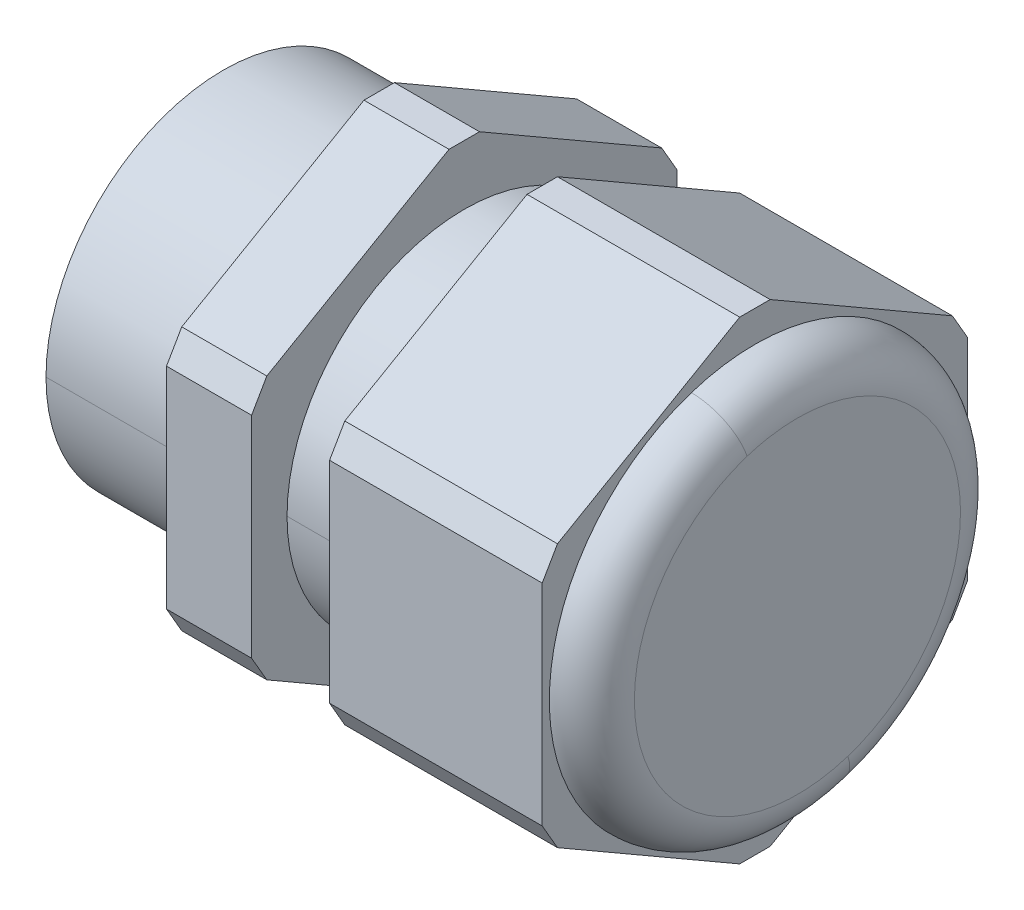
ISO-10303-21;
HEADER;
FILE_DESCRIPTION(('STEP AP214'),'2;1');
FILE_NAME('part.step','',(''),(''),'','','');
FILE_SCHEMA(('AUTOMOTIVE_DESIGN { 1 0 10303 214 1 1 1 1 }'));
ENDSEC;
DATA;
#1=APPLICATION_CONTEXT('core data for automotive mechanical design processes');
#2=APPLICATION_PROTOCOL_DEFINITION('international standard','automotive_design',2000,#1);
#3=PRODUCT_CONTEXT('',#1,'mechanical');
#4=PRODUCT('Part','Part','',(#3));
#5=PRODUCT_RELATED_PRODUCT_CATEGORY('part','',(#4));
#6=PRODUCT_DEFINITION_FORMATION('','',#4);
#7=PRODUCT_DEFINITION_CONTEXT('part definition',#1,'design');
#8=PRODUCT_DEFINITION('design','',#6,#7);
#9=PRODUCT_DEFINITION_SHAPE('','',#8);
#10=(LENGTH_UNIT() NAMED_UNIT(*) SI_UNIT(.MILLI.,.METRE.));
#11=(NAMED_UNIT(*) PLANE_ANGLE_UNIT() SI_UNIT($,.RADIAN.));
#12=(NAMED_UNIT(*) SI_UNIT($,.STERADIAN.) SOLID_ANGLE_UNIT());
#13=UNCERTAINTY_MEASURE_WITH_UNIT(LENGTH_MEASURE(1.E-05),#10,'distance_accuracy_value','');
#14=(GEOMETRIC_REPRESENTATION_CONTEXT(3) GLOBAL_UNCERTAINTY_ASSIGNED_CONTEXT((#13)) GLOBAL_UNIT_ASSIGNED_CONTEXT((#10,
#11,#12)) REPRESENTATION_CONTEXT('',''));
#15=CARTESIAN_POINT('',(0.,0.,0.));
#16=DIRECTION('',(0.,0.,1.));
#17=DIRECTION('',(1.,0.,0.));
#18=AXIS2_PLACEMENT_3D('',#15,#16,#17);
#19=CARTESIAN_POINT('',(40.5,0.,0.));
#20=DIRECTION('',(1.,0.,0.));
#21=DIRECTION('',(0.,1.,0.));
#22=AXIS2_PLACEMENT_3D('',#19,#20,#21);
#23=CYLINDRICAL_SURFACE('',#22,12.5);
#24=DIRECTION('',(1.,0.,0.));
#25=VECTOR('',#24,1.);
#26=CARTESIAN_POINT('',(17.,0.,12.5));
#27=LINE('',#26,#25);
#28=CARTESIAN_POINT('',(17.,0.,12.5));
#29=VERTEX_POINT('',#28);
#30=CARTESIAN_POINT('',(22.5,0.,12.5));
#31=VERTEX_POINT('',#30);
#32=EDGE_CURVE('E11',#29,#31,#27,.T.);
#33=ORIENTED_EDGE('',*,*,#32,.F.);
#34=CARTESIAN_POINT('',(17.,0.,0.));
#35=DIRECTION('',(1.,0.,0.));
#36=DIRECTION('',(0.,0.,-1.));
#37=AXIS2_PLACEMENT_3D('',#34,#35,#36);
#38=CIRCLE('',#37,12.5);
#39=CARTESIAN_POINT('',(17.,0.,-12.5));
#40=VERTEX_POINT('',#39);
#41=EDGE_CURVE('E25',#29,#40,#38,.T.);
#42=ORIENTED_EDGE('',*,*,#41,.T.);
#43=DIRECTION('',(1.,0.,0.));
#44=VECTOR('',#43,1.);
#45=CARTESIAN_POINT('',(17.,0.,-12.5));
#46=LINE('',#45,#44);
#47=CARTESIAN_POINT('',(22.5,0.,-12.5));
#48=VERTEX_POINT('',#47);
#49=EDGE_CURVE('E651',#40,#48,#46,.T.);
#50=ORIENTED_EDGE('',*,*,#49,.T.);
#51=CARTESIAN_POINT('',(22.5,0.,0.));
#52=DIRECTION('',(1.,0.,0.));
#53=DIRECTION('',(0.,0.,-1.));
#54=AXIS2_PLACEMENT_3D('',#51,#52,#53);
#55=CIRCLE('',#54,12.5);
#56=EDGE_CURVE('E646',#31,#48,#55,.T.);
#57=ORIENTED_EDGE('',*,*,#56,.F.);
#58=EDGE_LOOP('',(#33,#42,#50,#57));
#59=FACE_BOUND('',#58,.T.);
#60=ADVANCED_FACE('F17',(#59),#23,.T.);
#61=CARTESIAN_POINT('',(22.5,0.,0.));
#62=DIRECTION('',(1.,0.,0.));
#63=DIRECTION('',(0.,0.,-1.));
#64=AXIS2_PLACEMENT_3D('',#61,#62,#63);
#65=PLANE('',#64);
#66=CARTESIAN_POINT('',(22.5,0.,0.));
#67=DIRECTION('',(1.,0.,0.));
#68=DIRECTION('',(0.,0.,-1.));
#69=AXIS2_PLACEMENT_3D('',#66,#67,#68);
#70=CIRCLE('',#69,12.5);
#71=EDGE_CURVE('E641',#48,#31,#70,.T.);
#72=ORIENTED_EDGE('',*,*,#71,.T.);
#73=ORIENTED_EDGE('',*,*,#56,.T.);
#74=EDGE_LOOP('',(#72,#73));
#75=FACE_BOUND('',#74,.T.);
#76=DIRECTION('',(0.,-1.,0.));
#77=VECTOR('',#76,1.);
#78=CARTESIAN_POINT('',(22.5,8.6602540378444,15.));
#79=LINE('',#78,#77);
#80=CARTESIAN_POINT('',(22.5,7.41923788646729,15.));
#81=VERTEX_POINT('',#80);
#82=CARTESIAN_POINT('',(22.5,-7.41923788646736,15.));
#83=VERTEX_POINT('',#82);
#84=EDGE_CURVE('E636',#81,#83,#79,.T.);
#85=ORIENTED_EDGE('',*,*,#84,.F.);
#86=DIRECTION('',(0.,0.866025403784426,-0.500000000000021));
#87=VECTOR('',#86,1.);
#88=CARTESIAN_POINT('',(22.5,8.35000000000045,14.4626242432001));
#89=LINE('',#88,#87);
#90=CARTESIAN_POINT('',(22.5,9.28076211353304,13.9252484864005));
#91=VERTEX_POINT('',#90);
#92=EDGE_CURVE('E632',#81,#91,#89,.T.);
#93=ORIENTED_EDGE('',*,*,#92,.T.);
#94=DIRECTION('',(0.,-0.500000000000009,0.866025403784433));
#95=VECTOR('',#94,1.);
#96=CARTESIAN_POINT('',(22.5,17.320508075689,0.));
#97=LINE('',#96,#95);
#98=CARTESIAN_POINT('',(22.5,16.7,1.07475151360011));
#99=VERTEX_POINT('',#98);
#100=EDGE_CURVE('E627',#99,#91,#97,.T.);
#101=ORIENTED_EDGE('',*,*,#100,.F.);
#102=DIRECTION('',(0.,0.,-1.));
#103=VECTOR('',#102,1.);
#104=CARTESIAN_POINT('',(22.5,16.7,0.));
#105=LINE('',#104,#103);
#106=CARTESIAN_POINT('',(22.5,16.7,-1.07475151360011));
#107=VERTEX_POINT('',#106);
#108=EDGE_CURVE('E623',#99,#107,#105,.T.);
#109=ORIENTED_EDGE('',*,*,#108,.T.);
#110=DIRECTION('',(0.,0.500000000000009,0.866025403784433));
#111=VECTOR('',#110,1.);
#112=CARTESIAN_POINT('',(22.5,8.6602540378444,-15.));
#113=LINE('',#112,#111);
#114=CARTESIAN_POINT('',(22.5,9.28076211353298,-13.9252484864006));
#115=VERTEX_POINT('',#114);
#116=EDGE_CURVE('E618',#115,#107,#113,.T.);
#117=ORIENTED_EDGE('',*,*,#116,.F.);
#118=DIRECTION('',(0.,-0.866025403784428,-0.500000000000018));
#119=VECTOR('',#118,1.);
#120=CARTESIAN_POINT('',(22.5,8.35000000000041,-14.4626242432002));
#121=LINE('',#120,#119);
#122=CARTESIAN_POINT('',(22.5,7.41923788646736,-15.));
#123=VERTEX_POINT('',#122);
#124=EDGE_CURVE('E614',#115,#123,#121,.T.);
#125=ORIENTED_EDGE('',*,*,#124,.T.);
#126=DIRECTION('',(0.,1.,0.));
#127=VECTOR('',#126,1.);
#128=CARTESIAN_POINT('',(22.5,-8.6602540378444,-15.));
#129=LINE('',#128,#127);
#130=CARTESIAN_POINT('',(22.5,-7.41923788646729,-15.));
#131=VERTEX_POINT('',#130);
#132=EDGE_CURVE('E609',#131,#123,#129,.T.);
#133=ORIENTED_EDGE('',*,*,#132,.F.);
#134=DIRECTION('',(0.,-0.866025403784426,0.500000000000021));
#135=VECTOR('',#134,1.);
#136=CARTESIAN_POINT('',(22.5,-8.35000000000045,-14.4626242432001));
#137=LINE('',#136,#135);
#138=CARTESIAN_POINT('',(22.5,-9.28076211353304,-13.9252484864005));
#139=VERTEX_POINT('',#138);
#140=EDGE_CURVE('E605',#131,#139,#137,.T.);
#141=ORIENTED_EDGE('',*,*,#140,.T.);
#142=DIRECTION('',(0.,0.500000000000009,-0.866025403784433));
#143=VECTOR('',#142,1.);
#144=CARTESIAN_POINT('',(22.5,-17.320508075689,0.));
#145=LINE('',#144,#143);
#146=CARTESIAN_POINT('',(22.5,-16.7,-1.07475151360011));
#147=VERTEX_POINT('',#146);
#148=EDGE_CURVE('E600',#147,#139,#145,.T.);
#149=ORIENTED_EDGE('',*,*,#148,.F.);
#150=DIRECTION('',(0.,0.,1.));
#151=VECTOR('',#150,1.);
#152=CARTESIAN_POINT('',(22.5,-16.7,0.));
#153=LINE('',#152,#151);
#154=CARTESIAN_POINT('',(22.5,-16.7,1.07475151360011));
#155=VERTEX_POINT('',#154);
#156=EDGE_CURVE('E596',#147,#155,#153,.T.);
#157=ORIENTED_EDGE('',*,*,#156,.T.);
#158=DIRECTION('',(0.,-0.500000000000009,-0.866025403784433));
#159=VECTOR('',#158,1.);
#160=CARTESIAN_POINT('',(22.5,-8.6602540378444,15.));
#161=LINE('',#160,#159);
#162=CARTESIAN_POINT('',(22.5,-9.28076211353298,13.9252484864006));
#163=VERTEX_POINT('',#162);
#164=EDGE_CURVE('E591',#163,#155,#161,.T.);
#165=ORIENTED_EDGE('',*,*,#164,.F.);
#166=DIRECTION('',(0.,0.866025403784428,0.500000000000018));
#167=VECTOR('',#166,1.);
#168=CARTESIAN_POINT('',(22.5,-8.35000000000041,14.4626242432002));
#169=LINE('',#168,#167);
#170=EDGE_CURVE('E587',#163,#83,#169,.T.);
#171=ORIENTED_EDGE('',*,*,#170,.T.);
#172=EDGE_LOOP('',(#85,#93,#101,#109,#117,#125,#133,#141,#149,#157,#165,#171));
#173=FACE_BOUND('',#172,.T.);
#174=ADVANCED_FACE('F664',(#75,#173),#65,.F.);
#175=CARTESIAN_POINT('',(41.,0.,19.283498990934));
#176=DIRECTION('',(0.,0.500000000000018,-0.866025403784428));
#177=DIRECTION('',(0.,0.866025403784428,0.500000000000018));
#178=AXIS2_PLACEMENT_3D('',#175,#176,#177);
#179=PLANE('',#178);
#180=DIRECTION('',(1.,0.,0.));
#181=VECTOR('',#180,1.);
#182=CARTESIAN_POINT('',(22.5,-9.28076211353298,13.9252484864006));
#183=LINE('',#182,#181);
#184=CARTESIAN_POINT('',(37.5,-9.28076211353298,13.9252484864006));
#185=VERTEX_POINT('',#184);
#186=EDGE_CURVE('E583',#163,#185,#183,.T.);
#187=ORIENTED_EDGE('',*,*,#186,.T.);
#188=DIRECTION('',(0.,0.866025403784428,0.500000000000018));
#189=VECTOR('',#188,1.);
#190=CARTESIAN_POINT('',(37.5,-8.35000000000041,14.4626242432002));
#191=LINE('',#190,#189);
#192=CARTESIAN_POINT('',(37.5,-7.41923788646737,15.));
#193=VERTEX_POINT('',#192);
#194=EDGE_CURVE('E579',#185,#193,#191,.T.);
#195=ORIENTED_EDGE('',*,*,#194,.T.);
#196=DIRECTION('',(-1.,0.,0.));
#197=VECTOR('',#196,1.);
#198=CARTESIAN_POINT('',(22.5,-7.41923788646736,15.));
#199=LINE('',#198,#197);
#200=EDGE_CURVE('E574',#193,#83,#199,.T.);
#201=ORIENTED_EDGE('',*,*,#200,.T.);
#202=ORIENTED_EDGE('',*,*,#170,.F.);
#203=EDGE_LOOP('',(#187,#195,#201,#202));
#204=FACE_BOUND('',#203,.T.);
#205=ADVANCED_FACE('F667',(#204),#179,.F.);
#206=CARTESIAN_POINT('',(22.5,8.6602540378444,15.));
#207=DIRECTION('',(0.,0.,1.));
#208=DIRECTION('',(1.,0.,0.));
#209=AXIS2_PLACEMENT_3D('',#206,#207,#208);
#210=PLANE('',#209);
#211=DIRECTION('',(1.,0.,0.));
#212=VECTOR('',#211,1.);
#213=CARTESIAN_POINT('',(22.5,7.41923788646729,15.));
#214=LINE('',#213,#212);
#215=CARTESIAN_POINT('',(37.5,7.41923788646728,15.));
#216=VERTEX_POINT('',#215);
#217=EDGE_CURVE('E569',#81,#216,#214,.T.);
#218=ORIENTED_EDGE('',*,*,#217,.F.);
#219=ORIENTED_EDGE('',*,*,#84,.T.);
#220=ORIENTED_EDGE('',*,*,#200,.F.);
#221=DIRECTION('',(0.,-1.,0.));
#222=VECTOR('',#221,1.);
#223=CARTESIAN_POINT('',(37.5,8.6602540378444,15.));
#224=LINE('',#223,#222);
#225=EDGE_CURVE('E564',#216,#193,#224,.T.);
#226=ORIENTED_EDGE('',*,*,#225,.F.);
#227=EDGE_LOOP('',(#218,#219,#220,#226));
#228=FACE_BOUND('',#227,.T.);
#229=ADVANCED_FACE('F673',(#228),#210,.T.);
#230=CARTESIAN_POINT('',(37.5,0.,0.));
#231=DIRECTION('',(1.,0.,0.));
#232=DIRECTION('',(0.,0.,-1.));
#233=AXIS2_PLACEMENT_3D('',#230,#231,#232);
#234=PLANE('',#233);
#235=DIRECTION('',(0.,0.866025403784426,-0.500000000000021));
#236=VECTOR('',#235,1.);
#237=CARTESIAN_POINT('',(37.5,8.35000000000045,14.4626242432001));
#238=LINE('',#237,#236);
#239=CARTESIAN_POINT('',(37.5,9.28076211353304,13.9252484864005));
#240=VERTEX_POINT('',#239);
#241=EDGE_CURVE('E559',#216,#240,#238,.T.);
#242=ORIENTED_EDGE('',*,*,#241,.F.);
#243=ORIENTED_EDGE('',*,*,#225,.T.);
#244=ORIENTED_EDGE('',*,*,#194,.F.);
#245=DIRECTION('',(0.,-0.500000000000009,-0.866025403784433));
#246=VECTOR('',#245,1.);
#247=CARTESIAN_POINT('',(37.5,-8.6602540378444,15.));
#248=LINE('',#247,#246);
#249=CARTESIAN_POINT('',(37.5,-16.7,1.07475151360012));
#250=VERTEX_POINT('',#249);
#251=EDGE_CURVE('E555',#185,#250,#248,.T.);
#252=ORIENTED_EDGE('',*,*,#251,.T.);
#253=DIRECTION('',(0.,0.,1.));
#254=VECTOR('',#253,1.);
#255=CARTESIAN_POINT('',(37.5,-16.7,0.));
#256=LINE('',#255,#254);
#257=CARTESIAN_POINT('',(37.5,-16.7,-1.07475151360011));
#258=VERTEX_POINT('',#257);
#259=EDGE_CURVE('E550',#258,#250,#256,.T.);
#260=ORIENTED_EDGE('',*,*,#259,.F.);
#261=DIRECTION('',(0.,0.500000000000009,-0.866025403784433));
#262=VECTOR('',#261,1.);
#263=CARTESIAN_POINT('',(37.5,-17.320508075689,0.));
#264=LINE('',#263,#262);
#265=CARTESIAN_POINT('',(37.5,-9.28076211353304,-13.9252484864005));
#266=VERTEX_POINT('',#265);
#267=EDGE_CURVE('E546',#258,#266,#264,.T.);
#268=ORIENTED_EDGE('',*,*,#267,.T.);
#269=DIRECTION('',(0.,-0.866025403784426,0.500000000000021));
#270=VECTOR('',#269,1.);
#271=CARTESIAN_POINT('',(37.5,-8.35000000000045,-14.4626242432001));
#272=LINE('',#271,#270);
#273=CARTESIAN_POINT('',(37.5,-7.41923788646728,-15.));
#274=VERTEX_POINT('',#273);
#275=EDGE_CURVE('E541',#274,#266,#272,.T.);
#276=ORIENTED_EDGE('',*,*,#275,.F.);
#277=DIRECTION('',(0.,1.,0.));
#278=VECTOR('',#277,1.);
#279=CARTESIAN_POINT('',(37.5,-8.6602540378444,-15.));
#280=LINE('',#279,#278);
#281=CARTESIAN_POINT('',(37.5,7.41923788646737,-15.));
#282=VERTEX_POINT('',#281);
#283=EDGE_CURVE('E537',#274,#282,#280,.T.);
#284=ORIENTED_EDGE('',*,*,#283,.T.);
#285=DIRECTION('',(0.,-0.866025403784428,-0.500000000000018));
#286=VECTOR('',#285,1.);
#287=CARTESIAN_POINT('',(37.5,8.35000000000041,-14.4626242432002));
#288=LINE('',#287,#286);
#289=CARTESIAN_POINT('',(37.5,9.28076211353298,-13.9252484864006));
#290=VERTEX_POINT('',#289);
#291=EDGE_CURVE('E532',#290,#282,#288,.T.);
#292=ORIENTED_EDGE('',*,*,#291,.F.);
#293=DIRECTION('',(0.,0.500000000000009,0.866025403784433));
#294=VECTOR('',#293,1.);
#295=CARTESIAN_POINT('',(37.5,8.6602540378444,-15.));
#296=LINE('',#295,#294);
#297=CARTESIAN_POINT('',(37.5,16.7,-1.07475151360012));
#298=VERTEX_POINT('',#297);
#299=EDGE_CURVE('E528',#290,#298,#296,.T.);
#300=ORIENTED_EDGE('',*,*,#299,.T.);
#301=DIRECTION('',(0.,0.,-1.));
#302=VECTOR('',#301,1.);
#303=CARTESIAN_POINT('',(37.5,16.7,0.));
#304=LINE('',#303,#302);
#305=CARTESIAN_POINT('',(37.5,16.7,1.07475151360011));
#306=VERTEX_POINT('',#305);
#307=EDGE_CURVE('E523',#306,#298,#304,.T.);
#308=ORIENTED_EDGE('',*,*,#307,.F.);
#309=DIRECTION('',(0.,-0.500000000000009,0.866025403784433));
#310=VECTOR('',#309,1.);
#311=CARTESIAN_POINT('',(37.5,17.320508075689,0.));
#312=LINE('',#311,#310);
#313=EDGE_CURVE('E519',#306,#240,#312,.T.);
#314=ORIENTED_EDGE('',*,*,#313,.T.);
#315=EDGE_LOOP('',(#242,#243,#244,#252,#260,#268,#276,#284,#292,#300,#308,#314));
#316=FACE_BOUND('',#315,.T.);
#317=CARTESIAN_POINT('',(37.5,0.,0.));
#318=DIRECTION('',(-1.,0.,0.));
#319=DIRECTION('',(0.,0.,-1.));
#320=AXIS2_PLACEMENT_3D('',#317,#318,#319);
#321=CIRCLE('',#320,14.5);
#322=CARTESIAN_POINT('',(37.5,-13.7903194862797,-4.48074641843673));
#323=VERTEX_POINT('',#322);
#324=CARTESIAN_POINT('',(37.5,13.7903194862797,4.48074641843673));
#325=VERTEX_POINT('',#324);
#326=EDGE_CURVE('E515',#323,#325,#321,.T.);
#327=ORIENTED_EDGE('',*,*,#326,.T.);
#328=CARTESIAN_POINT('',(37.5,0.,0.));
#329=DIRECTION('',(-1.,0.,0.));
#330=DIRECTION('',(0.,0.951056516295154,0.309016994374948));
#331=AXIS2_PLACEMENT_3D('',#328,#329,#330);
#332=CIRCLE('',#331,14.5);
#333=EDGE_CURVE('E511',#325,#323,#332,.T.);
#334=ORIENTED_EDGE('',*,*,#333,.T.);
#335=EDGE_LOOP('',(#327,#334));
#336=FACE_BOUND('',#335,.T.);
#337=ADVANCED_FACE('F486',(#316,#336),#234,.T.);
#338=CARTESIAN_POINT('',(37.5000000000013,0.,0.));
#339=DIRECTION('',(1.,0.,0.));
#340=DIRECTION('',(0.,-0.309016994374947,0.951056516295154));
#341=AXIS2_PLACEMENT_3D('',#338,#339,#340);
#342=TOROIDAL_SURFACE('',#341,11.5000000000012,2.99999999999877);
#343=CARTESIAN_POINT('',(37.5000000000013,-10.9371499373954,-3.55369543531227));
#344=DIRECTION('',(0.,0.309016994374947,-0.951056516295154));
#345=DIRECTION('',(1.,0.,0.));
#346=AXIS2_PLACEMENT_3D('',#343,#344,#345);
#347=CIRCLE('',#346,2.99999999999878);
#348=CARTESIAN_POINT('',(40.5,-10.9371499373954,-3.55369543531227));
#349=VERTEX_POINT('',#348);
#350=EDGE_CURVE('E507',#349,#323,#347,.T.);
#351=ORIENTED_EDGE('',*,*,#350,.T.);
#352=ORIENTED_EDGE('',*,*,#333,.F.);
#353=CARTESIAN_POINT('',(37.5000000000013,10.9371499373954,3.55369543531227));
#354=DIRECTION('',(0.,-0.309016994374947,0.951056516295154));
#355=DIRECTION('',(1.,0.,0.));
#356=AXIS2_PLACEMENT_3D('',#353,#354,#355);
#357=CIRCLE('',#356,2.99999999999878);
#358=CARTESIAN_POINT('',(40.5,10.9371499373954,3.55369543531227));
#359=VERTEX_POINT('',#358);
#360=EDGE_CURVE('E504',#359,#325,#357,.T.);
#361=ORIENTED_EDGE('',*,*,#360,.F.);
#362=CARTESIAN_POINT('',(40.5,-10.9371499373943,-3.55369543531189));
#363=CARTESIAN_POINT('',(40.5,-10.378914091294,-5.27168285516736));
#364=CARTESIAN_POINT('',(40.5,-9.48349114026445,-6.88016511046981));
#365=CARTESIAN_POINT('',(40.5,-8.27896383223635,-8.29040938180622));
#366=CARTESIAN_POINT('',(40.5,-5.38188448091009,-10.5625389918183));
#367=CARTESIAN_POINT('',(40.5,-1.84083019396266,-11.570812747222));
#368=CARTESIAN_POINT('',(40.5,0.00809366772282216,-11.7163293638228));
#369=CARTESIAN_POINT('',(40.5,3.66327518860153,-11.2744017401015));
#370=CARTESIAN_POINT('',(40.5,6.88013769632168,-9.48346690555125));
#371=CARTESIAN_POINT('',(40.5,8.29041600052916,-8.27897131124694));
#372=CARTESIAN_POINT('',(40.5,10.5625406529741,-5.38188122070839));
#373=CARTESIAN_POINT('',(40.5,11.5708028061876,-1.84082923535546));
#374=CARTESIAN_POINT('',(40.5,11.7163650837496,0.00808573401813018));
#375=CARTESIAN_POINT('',(40.5,11.4953353200449,1.83569161888772));
#376=CARTESIAN_POINT('',(40.5,10.9371499373943,3.55369543531189));
#377=B_SPLINE_CURVE_WITH_KNOTS('',5,(#362,#363,#364,#365,#366,#367,#368,#369,#370,#371,#372,
#373,#374,#375,#376),.UNSPECIFIED.,.F.,.F.,(6,3,3,3,6),(0.,0.785398163397448,1.5707963267949,
2.35619449019234,3.14159265358979),.UNSPECIFIED.);
#378=EDGE_CURVE('E502',#349,#359,#377,.T.);
#379=ORIENTED_EDGE('',*,*,#378,.F.);
#380=EDGE_LOOP('',(#351,#352,#361,#379));
#381=FACE_BOUND('',#380,.T.);
#382=ADVANCED_FACE('F480',(#381),#342,.T.);
#383=CARTESIAN_POINT('',(40.5,11.5,0.));
#384=DIRECTION('',(-1.,0.,0.));
#385=DIRECTION('',(0.,0.,1.));
#386=AXIS2_PLACEMENT_3D('',#383,#384,#385);
#387=PLANE('',#386);
#388=CARTESIAN_POINT('',(40.5,0.,0.));
#389=DIRECTION('',(1.,0.,0.));
#390=DIRECTION('',(0.,0.,-1.));
#391=AXIS2_PLACEMENT_3D('',#388,#389,#390);
#392=CIRCLE('',#391,11.5);
#393=EDGE_CURVE('E460',#359,#349,#392,.T.);
#394=ORIENTED_EDGE('',*,*,#393,.T.);
#395=ORIENTED_EDGE('',*,*,#378,.T.);
#396=EDGE_LOOP('',(#394,#395));
#397=FACE_BOUND('',#396,.T.);
#398=ADVANCED_FACE('F469',(#397),#387,.F.);
#399=CARTESIAN_POINT('',(37.5000000000013,0.,0.));
#400=DIRECTION('',(1.,0.,0.));
#401=DIRECTION('',(0.,0.309016994374947,-0.951056516295154));
#402=AXIS2_PLACEMENT_3D('',#399,#400,#401);
#403=TOROIDAL_SURFACE('',#402,11.5000000000012,2.99999999999877);
#404=ORIENTED_EDGE('',*,*,#350,.F.);
#405=ORIENTED_EDGE('',*,*,#393,.F.);
#406=ORIENTED_EDGE('',*,*,#360,.T.);
#407=ORIENTED_EDGE('',*,*,#326,.F.);
#408=EDGE_LOOP('',(#404,#405,#406,#407));
#409=FACE_BOUND('',#408,.T.);
#410=ADVANCED_FACE('F479',(#409),#403,.T.);
#411=CARTESIAN_POINT('',(22.5,17.320508075689,0.));
#412=DIRECTION('',(0.,0.866025403784433,0.500000000000009));
#413=DIRECTION('',(0.,-0.500000000000009,0.866025403784433));
#414=AXIS2_PLACEMENT_3D('',#411,#412,#413);
#415=PLANE('',#414);
#416=DIRECTION('',(-1.,0.,0.));
#417=VECTOR('',#416,1.);
#418=CARTESIAN_POINT('',(22.5,9.28076211353304,13.9252484864005));
#419=LINE('',#418,#417);
#420=EDGE_CURVE('E455',#240,#91,#419,.T.);
#421=ORIENTED_EDGE('',*,*,#420,.F.);
#422=ORIENTED_EDGE('',*,*,#313,.F.);
#423=DIRECTION('',(1.,0.,0.));
#424=VECTOR('',#423,1.);
#425=CARTESIAN_POINT('',(22.5,16.7,1.07475151360011));
#426=LINE('',#425,#424);
#427=EDGE_CURVE('E450',#99,#306,#426,.T.);
#428=ORIENTED_EDGE('',*,*,#427,.F.);
#429=ORIENTED_EDGE('',*,*,#100,.T.);
#430=EDGE_LOOP('',(#421,#422,#428,#429));
#431=FACE_BOUND('',#430,.T.);
#432=ADVANCED_FACE('F681',(#431),#415,.T.);
#433=CARTESIAN_POINT('',(41.,16.7,-9.6417494954668));
#434=DIRECTION('',(0.,-1.,0.));
#435=DIRECTION('',(0.,0.,-1.));
#436=AXIS2_PLACEMENT_3D('',#433,#434,#435);
#437=PLANE('',#436);
#438=ORIENTED_EDGE('',*,*,#427,.T.);
#439=ORIENTED_EDGE('',*,*,#307,.T.);
#440=DIRECTION('',(-1.,0.,0.));
#441=VECTOR('',#440,1.);
#442=CARTESIAN_POINT('',(22.5,16.7,-1.07475151360011));
#443=LINE('',#442,#441);
#444=EDGE_CURVE('E445',#298,#107,#443,.T.);
#445=ORIENTED_EDGE('',*,*,#444,.T.);
#446=ORIENTED_EDGE('',*,*,#108,.F.);
#447=EDGE_LOOP('',(#438,#439,#445,#446));
#448=FACE_BOUND('',#447,.T.);
#449=ADVANCED_FACE('F686',(#448),#437,.F.);
#450=CARTESIAN_POINT('',(22.5,8.6602540378444,-15.));
#451=DIRECTION('',(0.,0.866025403784433,-0.500000000000009));
#452=DIRECTION('',(0.,0.500000000000009,0.866025403784433));
#453=AXIS2_PLACEMENT_3D('',#450,#451,#452);
#454=PLANE('',#453);
#455=ORIENTED_EDGE('',*,*,#444,.F.);
#456=ORIENTED_EDGE('',*,*,#299,.F.);
#457=DIRECTION('',(1.,0.,0.));
#458=VECTOR('',#457,1.);
#459=CARTESIAN_POINT('',(22.5,9.28076211353298,-13.9252484864006));
#460=LINE('',#459,#458);
#461=EDGE_CURVE('E440',#115,#290,#460,.T.);
#462=ORIENTED_EDGE('',*,*,#461,.F.);
#463=ORIENTED_EDGE('',*,*,#116,.T.);
#464=EDGE_LOOP('',(#455,#456,#462,#463));
#465=FACE_BOUND('',#464,.T.);
#466=ADVANCED_FACE('F689',(#465),#454,.T.);
#467=CARTESIAN_POINT('',(41.,0.,-19.283498990934));
#468=DIRECTION('',(0.,-0.500000000000018,0.866025403784428));
#469=DIRECTION('',(0.,-0.866025403784428,-0.500000000000018));
#470=AXIS2_PLACEMENT_3D('',#467,#468,#469);
#471=PLANE('',#470);
#472=ORIENTED_EDGE('',*,*,#461,.T.);
#473=ORIENTED_EDGE('',*,*,#291,.T.);
#474=DIRECTION('',(-1.,0.,0.));
#475=VECTOR('',#474,1.);
#476=CARTESIAN_POINT('',(22.5,7.41923788646736,-15.));
#477=LINE('',#476,#475);
#478=EDGE_CURVE('E435',#282,#123,#477,.T.);
#479=ORIENTED_EDGE('',*,*,#478,.T.);
#480=ORIENTED_EDGE('',*,*,#124,.F.);
#481=EDGE_LOOP('',(#472,#473,#479,#480));
#482=FACE_BOUND('',#481,.T.);
#483=ADVANCED_FACE('F692',(#482),#471,.F.);
#484=CARTESIAN_POINT('',(22.5,-8.6602540378444,-15.));
#485=DIRECTION('',(0.,0.,-1.));
#486=DIRECTION('',(-1.,0.,0.));
#487=AXIS2_PLACEMENT_3D('',#484,#485,#486);
#488=PLANE('',#487);
#489=ORIENTED_EDGE('',*,*,#478,.F.);
#490=ORIENTED_EDGE('',*,*,#283,.F.);
#491=DIRECTION('',(1.,0.,0.));
#492=VECTOR('',#491,1.);
#493=CARTESIAN_POINT('',(22.5,-7.41923788646729,-15.));
#494=LINE('',#493,#492);
#495=EDGE_CURVE('E430',#131,#274,#494,.T.);
#496=ORIENTED_EDGE('',*,*,#495,.F.);
#497=ORIENTED_EDGE('',*,*,#132,.T.);
#498=EDGE_LOOP('',(#489,#490,#496,#497));
#499=FACE_BOUND('',#498,.T.);
#500=ADVANCED_FACE('F698',(#499),#488,.T.);
#501=CARTESIAN_POINT('',(41.,-16.7,-9.6417494954667));
#502=DIRECTION('',(0.,0.500000000000021,0.866025403784426));
#503=DIRECTION('',(0.,-0.866025403784426,0.500000000000021));
#504=AXIS2_PLACEMENT_3D('',#501,#502,#503);
#505=PLANE('',#504);
#506=ORIENTED_EDGE('',*,*,#495,.T.);
#507=ORIENTED_EDGE('',*,*,#275,.T.);
#508=DIRECTION('',(-1.,0.,0.));
#509=VECTOR('',#508,1.);
#510=CARTESIAN_POINT('',(22.5,-9.28076211353304,-13.9252484864005));
#511=LINE('',#510,#509);
#512=EDGE_CURVE('E425',#266,#139,#511,.T.);
#513=ORIENTED_EDGE('',*,*,#512,.T.);
#514=ORIENTED_EDGE('',*,*,#140,.F.);
#515=EDGE_LOOP('',(#506,#507,#513,#514));
#516=FACE_BOUND('',#515,.T.);
#517=ADVANCED_FACE('F700',(#516),#505,.F.);
#518=CARTESIAN_POINT('',(22.5,-17.320508075689,0.));
#519=DIRECTION('',(0.,-0.866025403784433,-0.500000000000009));
#520=DIRECTION('',(0.,0.500000000000009,-0.866025403784433));
#521=AXIS2_PLACEMENT_3D('',#518,#519,#520);
#522=PLANE('',#521);
#523=ORIENTED_EDGE('',*,*,#512,.F.);
#524=ORIENTED_EDGE('',*,*,#267,.F.);
#525=DIRECTION('',(1.,0.,0.));
#526=VECTOR('',#525,1.);
#527=CARTESIAN_POINT('',(22.5,-16.7,-1.07475151360011));
#528=LINE('',#527,#526);
#529=EDGE_CURVE('E420',#147,#258,#528,.T.);
#530=ORIENTED_EDGE('',*,*,#529,.F.);
#531=ORIENTED_EDGE('',*,*,#148,.T.);
#532=EDGE_LOOP('',(#523,#524,#530,#531));
#533=FACE_BOUND('',#532,.T.);
#534=ADVANCED_FACE('F705',(#533),#522,.T.);
#535=CARTESIAN_POINT('',(41.,-16.7,9.6417494954668));
#536=DIRECTION('',(0.,1.,0.));
#537=DIRECTION('',(0.,0.,1.));
#538=AXIS2_PLACEMENT_3D('',#535,#536,#537);
#539=PLANE('',#538);
#540=ORIENTED_EDGE('',*,*,#529,.T.);
#541=ORIENTED_EDGE('',*,*,#259,.T.);
#542=DIRECTION('',(-1.,0.,0.));
#543=VECTOR('',#542,1.);
#544=CARTESIAN_POINT('',(22.5,-16.7,1.07475151360011));
#545=LINE('',#544,#543);
#546=EDGE_CURVE('E415',#250,#155,#545,.T.);
#547=ORIENTED_EDGE('',*,*,#546,.T.);
#548=ORIENTED_EDGE('',*,*,#156,.F.);
#549=EDGE_LOOP('',(#540,#541,#547,#548));
#550=FACE_BOUND('',#549,.T.);
#551=ADVANCED_FACE('F710',(#550),#539,.F.);
#552=CARTESIAN_POINT('',(22.5,-8.6602540378444,15.));
#553=DIRECTION('',(0.,-0.866025403784433,0.500000000000009));
#554=DIRECTION('',(0.,-0.500000000000009,-0.866025403784433));
#555=AXIS2_PLACEMENT_3D('',#552,#553,#554);
#556=PLANE('',#555);
#557=ORIENTED_EDGE('',*,*,#546,.F.);
#558=ORIENTED_EDGE('',*,*,#251,.F.);
#559=ORIENTED_EDGE('',*,*,#186,.F.);
#560=ORIENTED_EDGE('',*,*,#164,.T.);
#561=EDGE_LOOP('',(#557,#558,#559,#560));
#562=FACE_BOUND('',#561,.T.);
#563=ADVANCED_FACE('F713',(#562),#556,.T.);
#564=CARTESIAN_POINT('',(41.,16.7,9.6417494954667));
#565=DIRECTION('',(0.,-0.500000000000021,-0.866025403784426));
#566=DIRECTION('',(0.,0.866025403784426,-0.500000000000021));
#567=AXIS2_PLACEMENT_3D('',#564,#565,#566);
#568=PLANE('',#567);
#569=ORIENTED_EDGE('',*,*,#217,.T.);
#570=ORIENTED_EDGE('',*,*,#241,.T.);
#571=ORIENTED_EDGE('',*,*,#420,.T.);
#572=ORIENTED_EDGE('',*,*,#92,.F.);
#573=EDGE_LOOP('',(#569,#570,#571,#572));
#574=FACE_BOUND('',#573,.T.);
#575=ADVANCED_FACE('F676',(#574),#568,.F.);
#576=CARTESIAN_POINT('',(40.5,0.,0.));
#577=DIRECTION('',(1.,0.,0.));
#578=DIRECTION('',(0.,-1.,0.));
#579=AXIS2_PLACEMENT_3D('',#576,#577,#578);
#580=CYLINDRICAL_SURFACE('',#579,12.5);
#581=ORIENTED_EDGE('',*,*,#32,.T.);
#582=ORIENTED_EDGE('',*,*,#71,.F.);
#583=ORIENTED_EDGE('',*,*,#49,.F.);
#584=CARTESIAN_POINT('',(17.,0.,0.));
#585=DIRECTION('',(1.,0.,0.));
#586=DIRECTION('',(0.,0.,-1.));
#587=AXIS2_PLACEMENT_3D('',#584,#585,#586);
#588=CIRCLE('',#587,12.5);
#589=EDGE_CURVE('E411',#40,#29,#588,.T.);
#590=ORIENTED_EDGE('',*,*,#589,.T.);
#591=EDGE_LOOP('',(#581,#582,#583,#590));
#592=FACE_BOUND('',#591,.T.);
#593=ADVANCED_FACE('F662',(#592),#580,.T.);
#594=CARTESIAN_POINT('',(17.,0.,0.));
#595=DIRECTION('',(1.,0.,0.));
#596=DIRECTION('',(0.,0.,-1.));
#597=AXIS2_PLACEMENT_3D('',#594,#595,#596);
#598=PLANE('',#597);
#599=DIRECTION('',(0.,0.866025403784426,-0.500000000000021));
#600=VECTOR('',#599,1.);
#601=CARTESIAN_POINT('',(17.,8.35000000000045,14.4626242432001));
#602=LINE('',#601,#600);
#603=CARTESIAN_POINT('',(17.,7.41923788646728,15.));
#604=VERTEX_POINT('',#603);
#605=CARTESIAN_POINT('',(17.,9.28076211353304,13.9252484864005));
#606=VERTEX_POINT('',#605);
#607=EDGE_CURVE('E406',#604,#606,#602,.T.);
#608=ORIENTED_EDGE('',*,*,#607,.F.);
#609=DIRECTION('',(0.,-1.,0.));
#610=VECTOR('',#609,1.);
#611=CARTESIAN_POINT('',(17.,8.6602540378444,15.));
#612=LINE('',#611,#610);
#613=CARTESIAN_POINT('',(17.,-7.41923788646737,15.));
#614=VERTEX_POINT('',#613);
#615=EDGE_CURVE('E402',#604,#614,#612,.T.);
#616=ORIENTED_EDGE('',*,*,#615,.T.);
#617=DIRECTION('',(0.,0.866025403784428,0.500000000000018));
#618=VECTOR('',#617,1.);
#619=CARTESIAN_POINT('',(17.,-8.35000000000041,14.4626242432002));
#620=LINE('',#619,#618);
#621=CARTESIAN_POINT('',(17.,-9.28076211353298,13.9252484864006));
#622=VERTEX_POINT('',#621);
#623=EDGE_CURVE('E397',#622,#614,#620,.T.);
#624=ORIENTED_EDGE('',*,*,#623,.F.);
#625=DIRECTION('',(0.,-0.500000000000009,-0.866025403784433));
#626=VECTOR('',#625,1.);
#627=CARTESIAN_POINT('',(17.,-8.6602540378444,15.));
#628=LINE('',#627,#626);
#629=CARTESIAN_POINT('',(17.,-16.7,1.07475151360012));
#630=VERTEX_POINT('',#629);
#631=EDGE_CURVE('E393',#622,#630,#628,.T.);
#632=ORIENTED_EDGE('',*,*,#631,.T.);
#633=DIRECTION('',(0.,0.,1.));
#634=VECTOR('',#633,1.);
#635=CARTESIAN_POINT('',(17.,-16.7,0.));
#636=LINE('',#635,#634);
#637=CARTESIAN_POINT('',(17.,-16.7,-1.07475151360011));
#638=VERTEX_POINT('',#637);
#639=EDGE_CURVE('E388',#638,#630,#636,.T.);
#640=ORIENTED_EDGE('',*,*,#639,.F.);
#641=DIRECTION('',(0.,0.500000000000009,-0.866025403784433));
#642=VECTOR('',#641,1.);
#643=CARTESIAN_POINT('',(17.,-17.320508075689,0.));
#644=LINE('',#643,#642);
#645=CARTESIAN_POINT('',(17.,-9.28076211353304,-13.9252484864005));
#646=VERTEX_POINT('',#645);
#647=EDGE_CURVE('E384',#638,#646,#644,.T.);
#648=ORIENTED_EDGE('',*,*,#647,.T.);
#649=DIRECTION('',(0.,-0.866025403784426,0.500000000000021));
#650=VECTOR('',#649,1.);
#651=CARTESIAN_POINT('',(17.,-8.35000000000045,-14.4626242432001));
#652=LINE('',#651,#650);
#653=CARTESIAN_POINT('',(17.,-7.41923788646728,-15.));
#654=VERTEX_POINT('',#653);
#655=EDGE_CURVE('E379',#654,#646,#652,.T.);
#656=ORIENTED_EDGE('',*,*,#655,.F.);
#657=DIRECTION('',(0.,1.,0.));
#658=VECTOR('',#657,1.);
#659=CARTESIAN_POINT('',(17.,-8.6602540378444,-15.));
#660=LINE('',#659,#658);
#661=CARTESIAN_POINT('',(17.,7.41923788646737,-15.));
#662=VERTEX_POINT('',#661);
#663=EDGE_CURVE('E375',#654,#662,#660,.T.);
#664=ORIENTED_EDGE('',*,*,#663,.T.);
#665=DIRECTION('',(0.,-0.866025403784428,-0.500000000000018));
#666=VECTOR('',#665,1.);
#667=CARTESIAN_POINT('',(17.,8.35000000000041,-14.4626242432002));
#668=LINE('',#667,#666);
#669=CARTESIAN_POINT('',(17.,9.28076211353298,-13.9252484864006));
#670=VERTEX_POINT('',#669);
#671=EDGE_CURVE('E370',#670,#662,#668,.T.);
#672=ORIENTED_EDGE('',*,*,#671,.F.);
#673=DIRECTION('',(0.,0.500000000000009,0.866025403784433));
#674=VECTOR('',#673,1.);
#675=CARTESIAN_POINT('',(17.,8.6602540378444,-15.));
#676=LINE('',#675,#674);
#677=CARTESIAN_POINT('',(17.,16.7,-1.07475151360012));
#678=VERTEX_POINT('',#677);
#679=EDGE_CURVE('E366',#670,#678,#676,.T.);
#680=ORIENTED_EDGE('',*,*,#679,.T.);
#681=DIRECTION('',(0.,0.,-1.));
#682=VECTOR('',#681,1.);
#683=CARTESIAN_POINT('',(17.,16.7,0.));
#684=LINE('',#683,#682);
#685=CARTESIAN_POINT('',(17.,16.7,1.07475151360011));
#686=VERTEX_POINT('',#685);
#687=EDGE_CURVE('E361',#686,#678,#684,.T.);
#688=ORIENTED_EDGE('',*,*,#687,.F.);
#689=DIRECTION('',(0.,-0.500000000000009,0.866025403784433));
#690=VECTOR('',#689,1.);
#691=CARTESIAN_POINT('',(17.,17.320508075689,0.));
#692=LINE('',#691,#690);
#693=EDGE_CURVE('E357',#686,#606,#692,.T.);
#694=ORIENTED_EDGE('',*,*,#693,.T.);
#695=EDGE_LOOP('',(#608,#616,#624,#632,#640,#648,#656,#664,#672,#680,#688,#694));
#696=FACE_BOUND('',#695,.T.);
#697=ORIENTED_EDGE('',*,*,#41,.F.);
#698=ORIENTED_EDGE('',*,*,#589,.F.);
#699=EDGE_LOOP('',(#697,#698));
#700=FACE_BOUND('',#699,.T.);
#701=ADVANCED_FACE('F854',(#696,#700),#598,.T.);
#702=CARTESIAN_POINT('',(17.,17.320508075689,0.));
#703=DIRECTION('',(0.,-0.866025403784434,-0.500000000000009));
#704=DIRECTION('',(0.,0.500000000000009,-0.866025403784434));
#705=AXIS2_PLACEMENT_3D('',#702,#703,#704);
#706=PLANE('',#705);
#707=DIRECTION('',(0.,-0.500000000000009,0.866025403784433));
#708=VECTOR('',#707,1.);
#709=CARTESIAN_POINT('',(11.,17.320508075689,0.));
#710=LINE('',#709,#708);
#711=CARTESIAN_POINT('',(11.,16.7,1.07475151360011));
#712=VERTEX_POINT('',#711);
#713=CARTESIAN_POINT('',(11.,9.28076211353304,13.9252484864005));
#714=VERTEX_POINT('',#713);
#715=EDGE_CURVE('E353',#712,#714,#710,.T.);
#716=ORIENTED_EDGE('',*,*,#715,.T.);
#717=DIRECTION('',(1.,0.,0.));
#718=VECTOR('',#717,1.);
#719=CARTESIAN_POINT('',(17.,9.28076211353304,13.9252484864005));
#720=LINE('',#719,#718);
#721=EDGE_CURVE('E348',#714,#606,#720,.T.);
#722=ORIENTED_EDGE('',*,*,#721,.T.);
#723=ORIENTED_EDGE('',*,*,#693,.F.);
#724=DIRECTION('',(-1.,0.,0.));
#725=VECTOR('',#724,1.);
#726=CARTESIAN_POINT('',(17.,16.7,1.07475151360011));
#727=LINE('',#726,#725);
#728=EDGE_CURVE('E344',#686,#712,#727,.T.);
#729=ORIENTED_EDGE('',*,*,#728,.T.);
#730=EDGE_LOOP('',(#716,#722,#723,#729));
#731=FACE_BOUND('',#730,.T.);
#732=ADVANCED_FACE('F863',(#731),#706,.F.);
#733=CARTESIAN_POINT('',(41.,16.7,-9.6417494954668));
#734=DIRECTION('',(0.,-1.,0.));
#735=DIRECTION('',(0.,0.,-1.));
#736=AXIS2_PLACEMENT_3D('',#733,#734,#735);
#737=PLANE('',#736);
#738=DIRECTION('',(0.,0.,1.));
#739=VECTOR('',#738,1.);
#740=CARTESIAN_POINT('',(11.,16.7,-9.6417494954668));
#741=LINE('',#740,#739);
#742=CARTESIAN_POINT('',(11.,16.7,-1.07475151360012));
#743=VERTEX_POINT('',#742);
#744=EDGE_CURVE('E339',#743,#712,#741,.T.);
#745=ORIENTED_EDGE('',*,*,#744,.T.);
#746=ORIENTED_EDGE('',*,*,#728,.F.);
#747=ORIENTED_EDGE('',*,*,#687,.T.);
#748=DIRECTION('',(1.,0.,0.));
#749=VECTOR('',#748,1.);
#750=CARTESIAN_POINT('',(17.,16.7,-1.07475151360011));
#751=LINE('',#750,#749);
#752=EDGE_CURVE('E334',#743,#678,#751,.T.);
#753=ORIENTED_EDGE('',*,*,#752,.F.);
#754=EDGE_LOOP('',(#745,#746,#747,#753));
#755=FACE_BOUND('',#754,.T.);
#756=ADVANCED_FACE('F873',(#755),#737,.F.);
#757=CARTESIAN_POINT('',(17.,8.6602540378444,-15.));
#758=DIRECTION('',(0.,-0.866025403784434,0.500000000000009));
#759=DIRECTION('',(0.,-0.500000000000009,-0.866025403784434));
#760=AXIS2_PLACEMENT_3D('',#757,#758,#759);
#761=PLANE('',#760);
#762=DIRECTION('',(0.,0.500000000000009,0.866025403784433));
#763=VECTOR('',#762,1.);
#764=CARTESIAN_POINT('',(11.,8.6602540378444,-15.));
#765=LINE('',#764,#763);
#766=CARTESIAN_POINT('',(11.,9.28076211353298,-13.9252484864006));
#767=VERTEX_POINT('',#766);
#768=EDGE_CURVE('E329',#767,#743,#765,.T.);
#769=ORIENTED_EDGE('',*,*,#768,.T.);
#770=ORIENTED_EDGE('',*,*,#752,.T.);
#771=ORIENTED_EDGE('',*,*,#679,.F.);
#772=DIRECTION('',(-1.,0.,0.));
#773=VECTOR('',#772,1.);
#774=CARTESIAN_POINT('',(17.,9.28076211353298,-13.9252484864006));
#775=LINE('',#774,#773);
#776=EDGE_CURVE('E325',#670,#767,#775,.T.);
#777=ORIENTED_EDGE('',*,*,#776,.T.);
#778=EDGE_LOOP('',(#769,#770,#771,#777));
#779=FACE_BOUND('',#778,.T.);
#780=ADVANCED_FACE('F883',(#779),#761,.F.);
#781=CARTESIAN_POINT('',(41.,0.,-19.283498990934));
#782=DIRECTION('',(0.,-0.500000000000018,0.866025403784428));
#783=DIRECTION('',(0.,-0.866025403784428,-0.500000000000018));
#784=AXIS2_PLACEMENT_3D('',#781,#782,#783);
#785=PLANE('',#784);
#786=DIRECTION('',(0.,0.866025403784428,0.500000000000018));
#787=VECTOR('',#786,1.);
#788=CARTESIAN_POINT('',(11.,0.,-19.283498990934));
#789=LINE('',#788,#787);
#790=CARTESIAN_POINT('',(11.,7.41923788646735,-15.));
#791=VERTEX_POINT('',#790);
#792=EDGE_CURVE('E320',#791,#767,#789,.T.);
#793=ORIENTED_EDGE('',*,*,#792,.T.);
#794=ORIENTED_EDGE('',*,*,#776,.F.);
#795=ORIENTED_EDGE('',*,*,#671,.T.);
#796=DIRECTION('',(1.,0.,0.));
#797=VECTOR('',#796,1.);
#798=CARTESIAN_POINT('',(17.,7.41923788646736,-15.));
#799=LINE('',#798,#797);
#800=EDGE_CURVE('E315',#791,#662,#799,.T.);
#801=ORIENTED_EDGE('',*,*,#800,.F.);
#802=EDGE_LOOP('',(#793,#794,#795,#801));
#803=FACE_BOUND('',#802,.T.);
#804=ADVANCED_FACE('F893',(#803),#785,.F.);
#805=CARTESIAN_POINT('',(17.,-8.6602540378444,-15.));
#806=DIRECTION('',(0.,0.,1.));
#807=DIRECTION('',(1.,0.,0.));
#808=AXIS2_PLACEMENT_3D('',#805,#806,#807);
#809=PLANE('',#808);
#810=DIRECTION('',(0.,1.,0.));
#811=VECTOR('',#810,1.);
#812=CARTESIAN_POINT('',(11.,-8.6602540378444,-15.));
#813=LINE('',#812,#811);
#814=CARTESIAN_POINT('',(11.,-7.41923788646729,-15.));
#815=VERTEX_POINT('',#814);
#816=EDGE_CURVE('E310',#815,#791,#813,.T.);
#817=ORIENTED_EDGE('',*,*,#816,.T.);
#818=ORIENTED_EDGE('',*,*,#800,.T.);
#819=ORIENTED_EDGE('',*,*,#663,.F.);
#820=DIRECTION('',(-1.,0.,0.));
#821=VECTOR('',#820,1.);
#822=CARTESIAN_POINT('',(17.,-7.41923788646729,-15.));
#823=LINE('',#822,#821);
#824=EDGE_CURVE('E306',#654,#815,#823,.T.);
#825=ORIENTED_EDGE('',*,*,#824,.T.);
#826=EDGE_LOOP('',(#817,#818,#819,#825));
#827=FACE_BOUND('',#826,.T.);
#828=ADVANCED_FACE('F903',(#827),#809,.F.);
#829=CARTESIAN_POINT('',(41.,-16.7,-9.6417494954667));
#830=DIRECTION('',(0.,0.500000000000021,0.866025403784426));
#831=DIRECTION('',(0.,-0.866025403784426,0.500000000000021));
#832=AXIS2_PLACEMENT_3D('',#829,#830,#831);
#833=PLANE('',#832);
#834=DIRECTION('',(0.,0.866025403784426,-0.500000000000021));
#835=VECTOR('',#834,1.);
#836=CARTESIAN_POINT('',(11.,-16.7,-9.6417494954667));
#837=LINE('',#836,#835);
#838=CARTESIAN_POINT('',(11.,-9.28076211353304,-13.9252484864005));
#839=VERTEX_POINT('',#838);
#840=EDGE_CURVE('E301',#839,#815,#837,.T.);
#841=ORIENTED_EDGE('',*,*,#840,.T.);
#842=ORIENTED_EDGE('',*,*,#824,.F.);
#843=ORIENTED_EDGE('',*,*,#655,.T.);
#844=DIRECTION('',(1.,0.,0.));
#845=VECTOR('',#844,1.);
#846=CARTESIAN_POINT('',(17.,-9.28076211353304,-13.9252484864005));
#847=LINE('',#846,#845);
#848=EDGE_CURVE('E296',#839,#646,#847,.T.);
#849=ORIENTED_EDGE('',*,*,#848,.F.);
#850=EDGE_LOOP('',(#841,#842,#843,#849));
#851=FACE_BOUND('',#850,.T.);
#852=ADVANCED_FACE('F913',(#851),#833,.F.);
#853=CARTESIAN_POINT('',(17.,-17.320508075689,0.));
#854=DIRECTION('',(0.,0.866025403784434,0.500000000000009));
#855=DIRECTION('',(0.,-0.500000000000009,0.866025403784434));
#856=AXIS2_PLACEMENT_3D('',#853,#854,#855);
#857=PLANE('',#856);
#858=DIRECTION('',(0.,0.500000000000009,-0.866025403784433));
#859=VECTOR('',#858,1.);
#860=CARTESIAN_POINT('',(11.,-17.320508075689,0.));
#861=LINE('',#860,#859);
#862=CARTESIAN_POINT('',(11.,-16.7,-1.07475151360011));
#863=VERTEX_POINT('',#862);
#864=EDGE_CURVE('E291',#863,#839,#861,.T.);
#865=ORIENTED_EDGE('',*,*,#864,.T.);
#866=ORIENTED_EDGE('',*,*,#848,.T.);
#867=ORIENTED_EDGE('',*,*,#647,.F.);
#868=DIRECTION('',(-1.,0.,0.));
#869=VECTOR('',#868,1.);
#870=CARTESIAN_POINT('',(17.,-16.7,-1.07475151360011));
#871=LINE('',#870,#869);
#872=EDGE_CURVE('E287',#638,#863,#871,.T.);
#873=ORIENTED_EDGE('',*,*,#872,.T.);
#874=EDGE_LOOP('',(#865,#866,#867,#873));
#875=FACE_BOUND('',#874,.T.);
#876=ADVANCED_FACE('F923',(#875),#857,.F.);
#877=CARTESIAN_POINT('',(41.,-16.7,9.6417494954668));
#878=DIRECTION('',(0.,1.,0.));
#879=DIRECTION('',(0.,0.,1.));
#880=AXIS2_PLACEMENT_3D('',#877,#878,#879);
#881=PLANE('',#880);
#882=DIRECTION('',(0.,0.,-1.));
#883=VECTOR('',#882,1.);
#884=CARTESIAN_POINT('',(11.,-16.7,9.6417494954668));
#885=LINE('',#884,#883);
#886=CARTESIAN_POINT('',(11.,-16.7,1.07475151360012));
#887=VERTEX_POINT('',#886);
#888=EDGE_CURVE('E282',#887,#863,#885,.T.);
#889=ORIENTED_EDGE('',*,*,#888,.T.);
#890=ORIENTED_EDGE('',*,*,#872,.F.);
#891=ORIENTED_EDGE('',*,*,#639,.T.);
#892=DIRECTION('',(1.,0.,0.));
#893=VECTOR('',#892,1.);
#894=CARTESIAN_POINT('',(17.,-16.7,1.07475151360011));
#895=LINE('',#894,#893);
#896=EDGE_CURVE('E277',#887,#630,#895,.T.);
#897=ORIENTED_EDGE('',*,*,#896,.F.);
#898=EDGE_LOOP('',(#889,#890,#891,#897));
#899=FACE_BOUND('',#898,.T.);
#900=ADVANCED_FACE('F933',(#899),#881,.F.);
#901=CARTESIAN_POINT('',(17.,-8.6602540378444,15.));
#902=DIRECTION('',(0.,0.866025403784434,-0.500000000000009));
#903=DIRECTION('',(0.,0.500000000000009,0.866025403784434));
#904=AXIS2_PLACEMENT_3D('',#901,#902,#903);
#905=PLANE('',#904);
#906=DIRECTION('',(0.,-0.500000000000009,-0.866025403784433));
#907=VECTOR('',#906,1.);
#908=CARTESIAN_POINT('',(11.,-8.6602540378444,15.));
#909=LINE('',#908,#907);
#910=CARTESIAN_POINT('',(11.,-9.28076211353298,13.9252484864006));
#911=VERTEX_POINT('',#910);
#912=EDGE_CURVE('E272',#911,#887,#909,.T.);
#913=ORIENTED_EDGE('',*,*,#912,.T.);
#914=ORIENTED_EDGE('',*,*,#896,.T.);
#915=ORIENTED_EDGE('',*,*,#631,.F.);
#916=DIRECTION('',(-1.,0.,0.));
#917=VECTOR('',#916,1.);
#918=CARTESIAN_POINT('',(17.,-9.28076211353298,13.9252484864006));
#919=LINE('',#918,#917);
#920=EDGE_CURVE('E268',#622,#911,#919,.T.);
#921=ORIENTED_EDGE('',*,*,#920,.T.);
#922=EDGE_LOOP('',(#913,#914,#915,#921));
#923=FACE_BOUND('',#922,.T.);
#924=ADVANCED_FACE('F943',(#923),#905,.F.);
#925=CARTESIAN_POINT('',(41.,0.,19.283498990934));
#926=DIRECTION('',(0.,0.500000000000018,-0.866025403784428));
#927=DIRECTION('',(0.,0.866025403784428,0.500000000000018));
#928=AXIS2_PLACEMENT_3D('',#925,#926,#927);
#929=PLANE('',#928);
#930=DIRECTION('',(0.,-0.866025403784428,-0.500000000000018));
#931=VECTOR('',#930,1.);
#932=CARTESIAN_POINT('',(11.,0.,19.283498990934));
#933=LINE('',#932,#931);
#934=CARTESIAN_POINT('',(11.,-7.41923788646735,15.));
#935=VERTEX_POINT('',#934);
#936=EDGE_CURVE('E263',#935,#911,#933,.T.);
#937=ORIENTED_EDGE('',*,*,#936,.T.);
#938=ORIENTED_EDGE('',*,*,#920,.F.);
#939=ORIENTED_EDGE('',*,*,#623,.T.);
#940=DIRECTION('',(1.,0.,0.));
#941=VECTOR('',#940,1.);
#942=CARTESIAN_POINT('',(17.,-7.41923788646736,15.));
#943=LINE('',#942,#941);
#944=EDGE_CURVE('E258',#935,#614,#943,.T.);
#945=ORIENTED_EDGE('',*,*,#944,.F.);
#946=EDGE_LOOP('',(#937,#938,#939,#945));
#947=FACE_BOUND('',#946,.T.);
#948=ADVANCED_FACE('F953',(#947),#929,.F.);
#949=CARTESIAN_POINT('',(17.,8.6602540378444,15.));
#950=DIRECTION('',(0.,0.,-1.));
#951=DIRECTION('',(-1.,0.,0.));
#952=AXIS2_PLACEMENT_3D('',#949,#950,#951);
#953=PLANE('',#952);
#954=ORIENTED_EDGE('',*,*,#615,.F.);
#955=DIRECTION('',(-1.,0.,0.));
#956=VECTOR('',#955,1.);
#957=CARTESIAN_POINT('',(17.,7.41923788646729,15.));
#958=LINE('',#957,#956);
#959=CARTESIAN_POINT('',(11.,7.41923788646729,15.));
#960=VERTEX_POINT('',#959);
#961=EDGE_CURVE('E254',#604,#960,#958,.T.);
#962=ORIENTED_EDGE('',*,*,#961,.T.);
#963=DIRECTION('',(0.,-1.,0.));
#964=VECTOR('',#963,1.);
#965=CARTESIAN_POINT('',(11.,8.6602540378444,15.));
#966=LINE('',#965,#964);
#967=EDGE_CURVE('E249',#960,#935,#966,.T.);
#968=ORIENTED_EDGE('',*,*,#967,.T.);
#969=ORIENTED_EDGE('',*,*,#944,.T.);
#970=EDGE_LOOP('',(#954,#962,#968,#969));
#971=FACE_BOUND('',#970,.T.);
#972=ADVANCED_FACE('F963',(#971),#953,.F.);
#973=CARTESIAN_POINT('',(11.,0.,0.));
#974=DIRECTION('',(1.,0.,0.));
#975=DIRECTION('',(0.,0.,-1.));
#976=AXIS2_PLACEMENT_3D('',#973,#974,#975);
#977=PLANE('',#976);
#978=CARTESIAN_POINT('',(11.,0.,0.));
#979=DIRECTION('',(1.,0.,0.));
#980=DIRECTION('',(0.,0.,-1.));
#981=AXIS2_PLACEMENT_3D('',#978,#979,#980);
#982=CIRCLE('',#981,12.5);
#983=CARTESIAN_POINT('',(11.,0.,-12.5));
#984=VERTEX_POINT('',#983);
#985=CARTESIAN_POINT('',(11.,0.,12.5));
#986=VERTEX_POINT('',#985);
#987=EDGE_CURVE('E227',#984,#986,#982,.T.);
#988=ORIENTED_EDGE('',*,*,#987,.T.);
#989=CARTESIAN_POINT('',(11.,0.,0.));
#990=DIRECTION('',(1.,0.,0.));
#991=DIRECTION('',(0.,0.,-1.));
#992=AXIS2_PLACEMENT_3D('',#989,#990,#991);
#993=CIRCLE('',#992,12.5);
#994=EDGE_CURVE('E242',#986,#984,#993,.T.);
#995=ORIENTED_EDGE('',*,*,#994,.T.);
#996=EDGE_LOOP('',(#988,#995));
#997=FACE_BOUND('',#996,.T.);
#998=ORIENTED_EDGE('',*,*,#967,.F.);
#999=DIRECTION('',(0.,-0.866025403784426,0.500000000000021));
#1000=VECTOR('',#999,1.);
#1001=CARTESIAN_POINT('',(11.,16.7,9.6417494954667));
#1002=LINE('',#1001,#1000);
#1003=EDGE_CURVE('E237',#714,#960,#1002,.T.);
#1004=ORIENTED_EDGE('',*,*,#1003,.F.);
#1005=ORIENTED_EDGE('',*,*,#715,.F.);
#1006=ORIENTED_EDGE('',*,*,#744,.F.);
#1007=ORIENTED_EDGE('',*,*,#768,.F.);
#1008=ORIENTED_EDGE('',*,*,#792,.F.);
#1009=ORIENTED_EDGE('',*,*,#816,.F.);
#1010=ORIENTED_EDGE('',*,*,#840,.F.);
#1011=ORIENTED_EDGE('',*,*,#864,.F.);
#1012=ORIENTED_EDGE('',*,*,#888,.F.);
#1013=ORIENTED_EDGE('',*,*,#912,.F.);
#1014=ORIENTED_EDGE('',*,*,#936,.F.);
#1015=EDGE_LOOP('',(#998,#1004,#1005,#1006,#1007,#1008,#1009,#1010,#1011,#1012,#1013,#1014));
#1016=FACE_BOUND('',#1015,.T.);
#1017=ADVANCED_FACE('F973',(#997,#1016),#977,.F.);
#1018=CARTESIAN_POINT('',(41.,16.7,9.6417494954667));
#1019=DIRECTION('',(0.,-0.500000000000021,-0.866025403784426));
#1020=DIRECTION('',(0.,0.866025403784426,-0.500000000000021));
#1021=AXIS2_PLACEMENT_3D('',#1018,#1019,#1020);
#1022=PLANE('',#1021);
#1023=ORIENTED_EDGE('',*,*,#607,.T.);
#1024=ORIENTED_EDGE('',*,*,#721,.F.);
#1025=ORIENTED_EDGE('',*,*,#1003,.T.);
#1026=ORIENTED_EDGE('',*,*,#961,.F.);
#1027=EDGE_LOOP('',(#1023,#1024,#1025,#1026));
#1028=FACE_BOUND('',#1027,.T.);
#1029=ADVANCED_FACE('F983',(#1028),#1022,.F.);
#1030=CARTESIAN_POINT('',(40.5,0.,0.));
#1031=DIRECTION('',(1.,0.,0.));
#1032=DIRECTION('',(0.,1.,0.));
#1033=AXIS2_PLACEMENT_3D('',#1030,#1031,#1032);
#1034=CYLINDRICAL_SURFACE('',#1033,12.5);
#1035=DIRECTION('',(1.,0.,0.));
#1036=VECTOR('',#1035,1.);
#1037=CARTESIAN_POINT('',(0.,0.,12.5));
#1038=LINE('',#1037,#1036);
#1039=CARTESIAN_POINT('',(0.,0.,12.5));
#1040=VERTEX_POINT('',#1039);
#1041=EDGE_CURVE('E217',#1040,#986,#1038,.T.);
#1042=ORIENTED_EDGE('',*,*,#1041,.F.);
#1043=CARTESIAN_POINT('',(0.,0.,0.));
#1044=DIRECTION('',(1.,0.,0.));
#1045=DIRECTION('',(0.,0.,-1.));
#1046=AXIS2_PLACEMENT_3D('',#1043,#1044,#1045);
#1047=CIRCLE('',#1046,12.5);
#1048=CARTESIAN_POINT('',(0.,0.,-12.5));
#1049=VERTEX_POINT('',#1048);
#1050=EDGE_CURVE('E210',#1040,#1049,#1047,.T.);
#1051=ORIENTED_EDGE('',*,*,#1050,.T.);
#1052=DIRECTION('',(1.,0.,0.));
#1053=VECTOR('',#1052,1.);
#1054=CARTESIAN_POINT('',(0.,0.,-12.5));
#1055=LINE('',#1054,#1053);
#1056=EDGE_CURVE('E215',#1049,#984,#1055,.T.);
#1057=ORIENTED_EDGE('',*,*,#1056,.T.);
#1058=ORIENTED_EDGE('',*,*,#994,.F.);
#1059=EDGE_LOOP('',(#1042,#1051,#1057,#1058));
#1060=FACE_BOUND('',#1059,.T.);
#1061=ADVANCED_FACE('F212',(#1060),#1034,.T.);
#1062=CARTESIAN_POINT('',(40.5,0.,0.));
#1063=DIRECTION('',(1.,0.,0.));
#1064=DIRECTION('',(0.,-1.,0.));
#1065=AXIS2_PLACEMENT_3D('',#1062,#1063,#1064);
#1066=CYLINDRICAL_SURFACE('',#1065,12.5);
#1067=ORIENTED_EDGE('',*,*,#1041,.T.);
#1068=ORIENTED_EDGE('',*,*,#987,.F.);
#1069=ORIENTED_EDGE('',*,*,#1056,.F.);
#1070=CARTESIAN_POINT('',(0.,0.,0.));
#1071=DIRECTION('',(1.,0.,0.));
#1072=DIRECTION('',(0.,0.,-1.));
#1073=AXIS2_PLACEMENT_3D('',#1070,#1071,#1072);
#1074=CIRCLE('',#1073,12.5);
#1075=EDGE_CURVE('E221',#1049,#1040,#1074,.T.);
#1076=ORIENTED_EDGE('',*,*,#1075,.T.);
#1077=EDGE_LOOP('',(#1067,#1068,#1069,#1076));
#1078=FACE_BOUND('',#1077,.T.);
#1079=ADVANCED_FACE('F226',(#1078),#1066,.T.);
#1080=CARTESIAN_POINT('',(0.,0.,0.));
#1081=DIRECTION('',(1.,0.,0.));
#1082=DIRECTION('',(0.,0.,-1.));
#1083=AXIS2_PLACEMENT_3D('',#1080,#1081,#1082);
#1084=PLANE('',#1083);
#1085=ORIENTED_EDGE('',*,*,#1050,.F.);
#1086=ORIENTED_EDGE('',*,*,#1075,.F.);
#1087=EDGE_LOOP('',(#1085,#1086));
#1088=FACE_BOUND('',#1087,.T.);
#1089=ADVANCED_FACE('F222',(#1088),#1084,.F.);
#1090=CLOSED_SHELL('',(#60,#174,#205,#229,#337,#382,#398,#410,#432,#449,#466,#483,#500,#517,
#534,#551,#563,#575,#593,#701,#732,#756,#780,#804,#828,#852,#876,#900,#924,#948,#972,#1017,
#1029,#1061,#1079,#1089));
#1091=MANIFOLD_SOLID_BREP('B1',#1090);
#1092=ADVANCED_BREP_SHAPE_REPRESENTATION('',(#18,#1091),#14);
#1093=SHAPE_DEFINITION_REPRESENTATION(#9,#1092);
ENDSEC;
END-ISO-10303-21;
